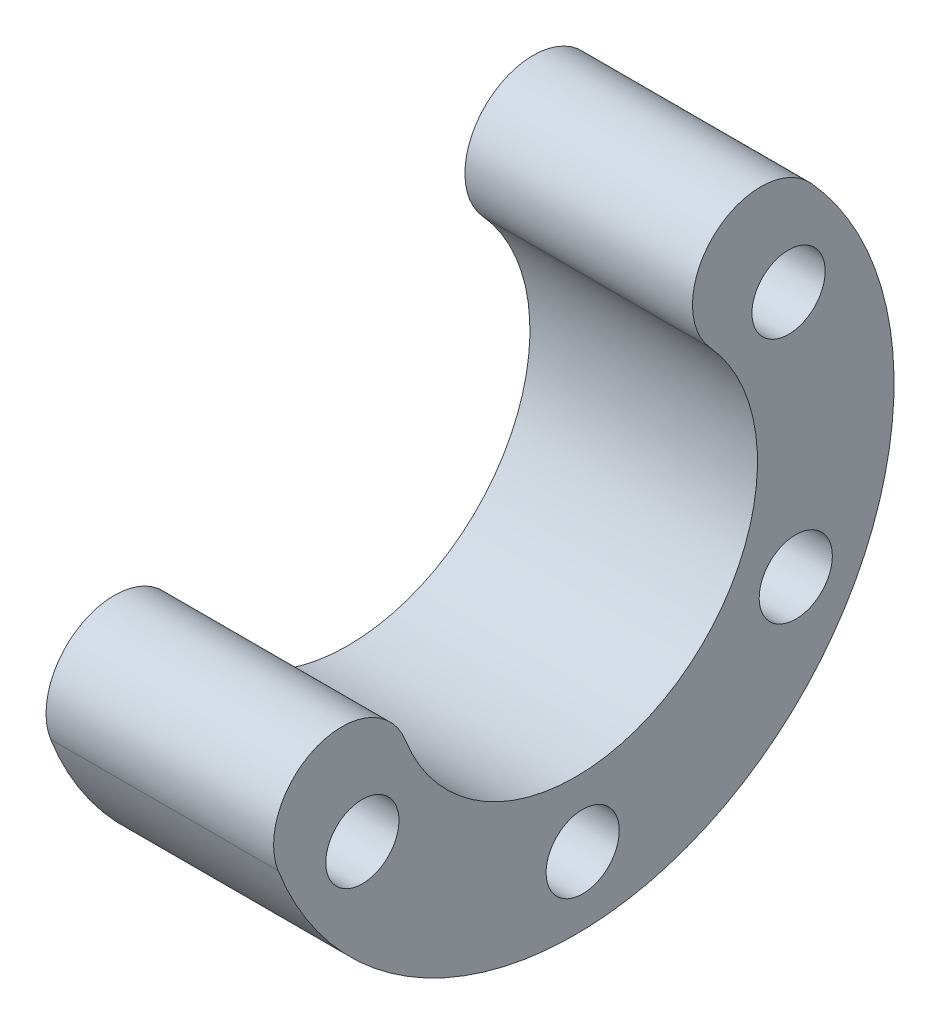
ISO-10303-21;
HEADER;
FILE_DESCRIPTION(('STEP AP214'),'2;1');
FILE_NAME('part.step','',(''),(''),'','','');
FILE_SCHEMA(('AUTOMOTIVE_DESIGN { 1 0 10303 214 1 1 1 1 }'));
ENDSEC;
DATA;
#1=APPLICATION_CONTEXT('core data for automotive mechanical design processes');
#2=APPLICATION_PROTOCOL_DEFINITION('international standard','automotive_design',2000,#1);
#3=PRODUCT_CONTEXT('',#1,'mechanical');
#4=PRODUCT('Part','Part','',(#3));
#5=PRODUCT_RELATED_PRODUCT_CATEGORY('part','',(#4));
#6=PRODUCT_DEFINITION_FORMATION('','',#4);
#7=PRODUCT_DEFINITION_CONTEXT('part definition',#1,'design');
#8=PRODUCT_DEFINITION('design','',#6,#7);
#9=PRODUCT_DEFINITION_SHAPE('','',#8);
#10=(LENGTH_UNIT() NAMED_UNIT(*) SI_UNIT(.MILLI.,.METRE.));
#11=(NAMED_UNIT(*) PLANE_ANGLE_UNIT() SI_UNIT($,.RADIAN.));
#12=(NAMED_UNIT(*) SI_UNIT($,.STERADIAN.) SOLID_ANGLE_UNIT());
#13=UNCERTAINTY_MEASURE_WITH_UNIT(LENGTH_MEASURE(1.E-05),#10,'distance_accuracy_value','');
#14=(GEOMETRIC_REPRESENTATION_CONTEXT(3) GLOBAL_UNCERTAINTY_ASSIGNED_CONTEXT((#13)) GLOBAL_UNIT_ASSIGNED_CONTEXT((#10,
#11,#12)) REPRESENTATION_CONTEXT('',''));
#15=CARTESIAN_POINT('',(0.,0.,0.));
#16=DIRECTION('',(0.,0.,1.));
#17=DIRECTION('',(1.,0.,0.));
#18=AXIS2_PLACEMENT_3D('',#15,#16,#17);
#19=CARTESIAN_POINT('',(295.275,283.808614119369,244.780770815134));
#20=DIRECTION('',(-1.,0.,0.));
#21=DIRECTION('',(0.,-1.,0.));
#22=AXIS2_PLACEMENT_3D('',#19,#20,#21);
#23=PLANE('',#22);
#24=CARTESIAN_POINT('',(295.275,249.599038311439,241.648955537477));
#25=DIRECTION('',(-1.,0.,0.));
#26=DIRECTION('',(0.,-1.,0.));
#27=AXIS2_PLACEMENT_3D('',#24,#25,#26);
#28=CIRCLE('',#27,2.5527);
#29=CARTESIAN_POINT('',(295.275,247.046338311439,241.648955537477));
#30=VERTEX_POINT('',#29);
#31=EDGE_CURVE('E79',#30,#30,#28,.F.);
#32=ORIENTED_EDGE('',*,*,#31,.T.);
#33=EDGE_LOOP('',(#32));
#34=FACE_BOUND('',#33,.T.);
#35=CARTESIAN_POINT('',(295.275,241.307253431596,226.28063715984));
#36=DIRECTION('',(-1.,0.,0.));
#37=DIRECTION('',(0.,-1.,0.));
#38=AXIS2_PLACEMENT_3D('',#35,#36,#37);
#39=CIRCLE('',#38,2.5527);
#40=CARTESIAN_POINT('',(295.275,238.754553431596,226.28063715984));
#41=VERTEX_POINT('',#40);
#42=EDGE_CURVE('E92',#41,#41,#39,.F.);
#43=ORIENTED_EDGE('',*,*,#42,.T.);
#44=EDGE_LOOP('',(#43));
#45=FACE_BOUND('',#44,.T.);
#46=CARTESIAN_POINT('',(295.275,270.504114631188,213.858212702891));
#47=DIRECTION('',(-1.,0.,0.));
#48=DIRECTION('',(0.,-1.,0.));
#49=AXIS2_PLACEMENT_3D('',#46,#47,#48);
#50=CIRCLE('',#49,4.7625);
#51=CARTESIAN_POINT('',(295.275,273.706373166967,210.333025258225));
#52=VERTEX_POINT('',#51);
#53=CARTESIAN_POINT('',(295.275,267.301856095409,217.383400147557));
#54=VERTEX_POINT('',#53);
#55=EDGE_CURVE('E74',#52,#54,#50,.F.);
#56=ORIENTED_EDGE('',*,*,#55,.F.);
#57=CARTESIAN_POINT('',(295.275,258.7625,226.7839));
#58=DIRECTION('',(-1.,0.,0.));
#59=DIRECTION('',(0.,-1.,0.));
#60=AXIS2_PLACEMENT_3D('',#57,#58,#59);
#61=CIRCLE('',#60,22.225);
#62=CARTESIAN_POINT('',(295.275,250.779259548962,247.52560911234));
#63=VERTEX_POINT('',#62);
#64=EDGE_CURVE('E62',#52,#63,#61,.T.);
#65=ORIENTED_EDGE('',*,*,#64,.T.);
#66=CARTESIAN_POINT('',(295.275,252.489953931327,243.080957159695));
#67=DIRECTION('',(-1.,0.,0.));
#68=DIRECTION('',(0.,-1.,0.));
#69=AXIS2_PLACEMENT_3D('',#66,#67,#68);
#70=CIRCLE('',#69,4.7625);
#71=CARTESIAN_POINT('',(295.275,254.200648313691,238.636305207051));
#72=VERTEX_POINT('',#71);
#73=EDGE_CURVE('E71',#63,#72,#70,.T.);
#74=ORIENTED_EDGE('',*,*,#73,.T.);
#75=CARTESIAN_POINT('',(295.275,258.7625,226.7839));
#76=DIRECTION('',(-1.,0.,0.));
#77=DIRECTION('',(0.,-1.,0.));
#78=AXIS2_PLACEMENT_3D('',#75,#76,#77);
#79=CIRCLE('',#78,12.7);
#80=EDGE_CURVE('E101',#54,#72,#79,.T.);
#81=ORIENTED_EDGE('',*,*,#80,.F.);
#82=EDGE_LOOP('',(#56,#65,#74,#81));
#83=FACE_BOUND('',#82,.T.);
#84=CARTESIAN_POINT('',(295.275,267.925961688557,211.918844462521));
#85=DIRECTION('',(-1.,0.,0.));
#86=DIRECTION('',(0.,-1.,0.));
#87=AXIS2_PLACEMENT_3D('',#84,#85,#86);
#88=CIRCLE('',#87,2.5527);
#89=CARTESIAN_POINT('',(295.275,265.373261688557,211.918844462521));
#90=VERTEX_POINT('',#89);
#91=EDGE_CURVE('E96',#90,#90,#88,.F.);
#92=ORIENTED_EDGE('',*,*,#91,.T.);
#93=EDGE_LOOP('',(#92));
#94=FACE_BOUND('',#93,.T.);
#95=CARTESIAN_POINT('',(295.275,250.470715120155,211.415581622363));
#96=DIRECTION('',(-1.,0.,0.));
#97=DIRECTION('',(0.,-1.,0.));
#98=AXIS2_PLACEMENT_3D('',#95,#96,#97);
#99=CIRCLE('',#98,2.5527);
#100=CARTESIAN_POINT('',(295.275,247.918015120155,211.415581622363));
#101=VERTEX_POINT('',#100);
#102=EDGE_CURVE('E85',#101,#101,#99,.F.);
#103=ORIENTED_EDGE('',*,*,#102,.T.);
#104=EDGE_LOOP('',(#103));
#105=FACE_BOUND('',#104,.T.);
#106=ADVANCED_FACE('F17',(#34,#45,#83,#94,#105),#23,.T.);
#107=CARTESIAN_POINT('',(295.273,258.7625,226.7839));
#108=DIRECTION('',(1.,0.,0.));
#109=DIRECTION('',(0.,1.,0.));
#110=AXIS2_PLACEMENT_3D('',#107,#108,#109);
#111=CYLINDRICAL_SURFACE('',#110,22.225);
#112=ORIENTED_EDGE('',*,*,#64,.F.);
#113=DIRECTION('',(1.,0.,0.));
#114=VECTOR('',#113,1.);
#115=CARTESIAN_POINT('',(295.273,273.706373166967,210.333025258225));
#116=LINE('',#115,#114);
#117=CARTESIAN_POINT('',(311.15,273.706373166967,210.333025258225));
#118=VERTEX_POINT('',#117);
#119=EDGE_CURVE('E35',#52,#118,#116,.T.);
#120=ORIENTED_EDGE('',*,*,#119,.T.);
#121=CARTESIAN_POINT('',(311.15,258.7625,226.7839));
#122=DIRECTION('',(-1.,0.,0.));
#123=DIRECTION('',(0.,-1.,0.));
#124=AXIS2_PLACEMENT_3D('',#121,#122,#123);
#125=CIRCLE('',#124,22.225);
#126=CARTESIAN_POINT('',(311.15,250.779259548962,247.52560911234));
#127=VERTEX_POINT('',#126);
#128=EDGE_CURVE('E63',#118,#127,#125,.T.);
#129=ORIENTED_EDGE('',*,*,#128,.T.);
#130=DIRECTION('',(1.,0.,0.));
#131=VECTOR('',#130,1.);
#132=CARTESIAN_POINT('',(295.273,250.779259548962,247.52560911234));
#133=LINE('',#132,#131);
#134=EDGE_CURVE('E43',#63,#127,#133,.T.);
#135=ORIENTED_EDGE('',*,*,#134,.F.);
#136=EDGE_LOOP('',(#112,#120,#129,#135));
#137=FACE_BOUND('',#136,.T.);
#138=ADVANCED_FACE('F61',(#137),#111,.T.);
#139=CARTESIAN_POINT('',(311.15,186.166852461199,298.45));
#140=DIRECTION('',(-1.,0.,0.));
#141=DIRECTION('',(0.,-1.,0.));
#142=AXIS2_PLACEMENT_3D('',#139,#140,#141);
#143=PLANE('',#142);
#144=CARTESIAN_POINT('',(311.15,267.925961688557,211.918844462521));
#145=DIRECTION('',(1.,0.,0.));
#146=DIRECTION('',(0.,1.,0.));
#147=AXIS2_PLACEMENT_3D('',#144,#145,#146);
#148=CIRCLE('',#147,2.5527);
#149=CARTESIAN_POINT('',(311.15,270.478661688557,211.918844462521));
#150=VERTEX_POINT('',#149);
#151=EDGE_CURVE('E11',#150,#150,#148,.T.);
#152=ORIENTED_EDGE('',*,*,#151,.F.);
#153=EDGE_LOOP('',(#152));
#154=FACE_BOUND('',#153,.T.);
#155=CARTESIAN_POINT('',(311.15,241.307253431596,226.28063715984));
#156=DIRECTION('',(1.,0.,0.));
#157=DIRECTION('',(0.,1.,0.));
#158=AXIS2_PLACEMENT_3D('',#155,#156,#157);
#159=CIRCLE('',#158,2.5527);
#160=CARTESIAN_POINT('',(311.15,243.859953431595,226.28063715984));
#161=VERTEX_POINT('',#160);
#162=EDGE_CURVE('E27',#161,#161,#159,.T.);
#163=ORIENTED_EDGE('',*,*,#162,.F.);
#164=EDGE_LOOP('',(#163));
#165=FACE_BOUND('',#164,.T.);
#166=CARTESIAN_POINT('',(311.15,250.470715120155,211.415581622363));
#167=DIRECTION('',(1.,0.,0.));
#168=DIRECTION('',(0.,1.,0.));
#169=AXIS2_PLACEMENT_3D('',#166,#167,#168);
#170=CIRCLE('',#169,2.5527);
#171=CARTESIAN_POINT('',(311.15,253.023415120155,211.415581622363));
#172=VERTEX_POINT('',#171);
#173=EDGE_CURVE('E127',#172,#172,#170,.T.);
#174=ORIENTED_EDGE('',*,*,#173,.F.);
#175=EDGE_LOOP('',(#174));
#176=FACE_BOUND('',#175,.T.);
#177=CARTESIAN_POINT('',(311.15,249.599038311439,241.648955537477));
#178=DIRECTION('',(1.,0.,0.));
#179=DIRECTION('',(0.,1.,0.));
#180=AXIS2_PLACEMENT_3D('',#177,#178,#179);
#181=CIRCLE('',#180,2.5527);
#182=CARTESIAN_POINT('',(311.15,252.151738311438,241.648955537477));
#183=VERTEX_POINT('',#182);
#184=EDGE_CURVE('E123',#183,#183,#181,.T.);
#185=ORIENTED_EDGE('',*,*,#184,.F.);
#186=EDGE_LOOP('',(#185));
#187=FACE_BOUND('',#186,.T.);
#188=CARTESIAN_POINT('',(311.15,270.504114631188,213.858212702891));
#189=DIRECTION('',(1.,0.,0.));
#190=DIRECTION('',(0.,-1.,0.));
#191=AXIS2_PLACEMENT_3D('',#188,#189,#190);
#192=CIRCLE('',#191,4.7625);
#193=CARTESIAN_POINT('',(311.15,267.301856095409,217.383400147557));
#194=VERTEX_POINT('',#193);
#195=EDGE_CURVE('E120',#118,#194,#192,.T.);
#196=ORIENTED_EDGE('',*,*,#195,.T.);
#197=CARTESIAN_POINT('',(311.15,258.7625,226.7839));
#198=DIRECTION('',(-1.,0.,0.));
#199=DIRECTION('',(0.,-1.,0.));
#200=AXIS2_PLACEMENT_3D('',#197,#198,#199);
#201=CIRCLE('',#200,12.7);
#202=CARTESIAN_POINT('',(311.15,254.200648313691,238.636305207051));
#203=VERTEX_POINT('',#202);
#204=EDGE_CURVE('E106',#194,#203,#201,.T.);
#205=ORIENTED_EDGE('',*,*,#204,.T.);
#206=CARTESIAN_POINT('',(311.15,252.489953931327,243.080957159695));
#207=DIRECTION('',(-1.,0.,0.));
#208=DIRECTION('',(0.,-1.,0.));
#209=AXIS2_PLACEMENT_3D('',#206,#207,#208);
#210=CIRCLE('',#209,4.7625);
#211=EDGE_CURVE('E113',#127,#203,#210,.T.);
#212=ORIENTED_EDGE('',*,*,#211,.F.);
#213=ORIENTED_EDGE('',*,*,#128,.F.);
#214=EDGE_LOOP('',(#196,#205,#212,#213));
#215=FACE_BOUND('',#214,.T.);
#216=ADVANCED_FACE('F147',(#154,#165,#176,#187,#215),#143,.F.);
#217=CARTESIAN_POINT('',(295.273,252.489953931327,243.080957159695));
#218=DIRECTION('',(1.,0.,0.));
#219=DIRECTION('',(0.,1.,0.));
#220=AXIS2_PLACEMENT_3D('',#217,#218,#219);
#221=CYLINDRICAL_SURFACE('',#220,4.7625);
#222=ORIENTED_EDGE('',*,*,#73,.F.);
#223=ORIENTED_EDGE('',*,*,#134,.T.);
#224=ORIENTED_EDGE('',*,*,#211,.T.);
#225=DIRECTION('',(1.,0.,0.));
#226=VECTOR('',#225,1.);
#227=CARTESIAN_POINT('',(295.273,254.200648313691,238.636305207051));
#228=LINE('',#227,#226);
#229=EDGE_CURVE('E65',#72,#203,#228,.T.);
#230=ORIENTED_EDGE('',*,*,#229,.F.);
#231=EDGE_LOOP('',(#222,#223,#224,#230));
#232=FACE_BOUND('',#231,.T.);
#233=ADVANCED_FACE('F77',(#232),#221,.T.);
#234=CARTESIAN_POINT('',(295.273,270.504114631188,213.858212702891));
#235=DIRECTION('',(1.,0.,0.));
#236=DIRECTION('',(0.,1.,0.));
#237=AXIS2_PLACEMENT_3D('',#234,#235,#236);
#238=CYLINDRICAL_SURFACE('',#237,4.7625);
#239=ORIENTED_EDGE('',*,*,#119,.F.);
#240=ORIENTED_EDGE('',*,*,#55,.T.);
#241=DIRECTION('',(1.,0.,0.));
#242=VECTOR('',#241,1.);
#243=CARTESIAN_POINT('',(295.273,267.301856095409,217.383400147557));
#244=LINE('',#243,#242);
#245=EDGE_CURVE('E21',#54,#194,#244,.T.);
#246=ORIENTED_EDGE('',*,*,#245,.T.);
#247=ORIENTED_EDGE('',*,*,#195,.F.);
#248=EDGE_LOOP('',(#239,#240,#246,#247));
#249=FACE_BOUND('',#248,.T.);
#250=ADVANCED_FACE('F136',(#249),#238,.T.);
#251=CARTESIAN_POINT('',(295.273,258.7625,226.7839));
#252=DIRECTION('',(1.,0.,0.));
#253=DIRECTION('',(0.,1.,0.));
#254=AXIS2_PLACEMENT_3D('',#251,#252,#253);
#255=CYLINDRICAL_SURFACE('',#254,12.7);
#256=ORIENTED_EDGE('',*,*,#245,.F.);
#257=ORIENTED_EDGE('',*,*,#80,.T.);
#258=ORIENTED_EDGE('',*,*,#229,.T.);
#259=ORIENTED_EDGE('',*,*,#204,.F.);
#260=EDGE_LOOP('',(#256,#257,#258,#259));
#261=FACE_BOUND('',#260,.T.);
#262=ADVANCED_FACE('F19',(#261),#255,.F.);
#263=CARTESIAN_POINT('',(295.273,267.925961688557,211.918844462521));
#264=DIRECTION('',(1.,0.,0.));
#265=DIRECTION('',(0.,1.,0.));
#266=AXIS2_PLACEMENT_3D('',#263,#264,#265);
#267=CYLINDRICAL_SURFACE('',#266,2.5527);
#268=ORIENTED_EDGE('',*,*,#151,.T.);
#269=EDGE_LOOP('',(#268));
#270=FACE_BOUND('',#269,.T.);
#271=ORIENTED_EDGE('',*,*,#91,.F.);
#272=EDGE_LOOP('',(#271));
#273=FACE_BOUND('',#272,.T.);
#274=ADVANCED_FACE('F138',(#270,#273),#267,.F.);
#275=CARTESIAN_POINT('',(295.273,241.307253431596,226.28063715984));
#276=DIRECTION('',(1.,0.,0.));
#277=DIRECTION('',(0.,1.,0.));
#278=AXIS2_PLACEMENT_3D('',#275,#276,#277);
#279=CYLINDRICAL_SURFACE('',#278,2.5527);
#280=ORIENTED_EDGE('',*,*,#162,.T.);
#281=EDGE_LOOP('',(#280));
#282=FACE_BOUND('',#281,.T.);
#283=ORIENTED_EDGE('',*,*,#42,.F.);
#284=EDGE_LOOP('',(#283));
#285=FACE_BOUND('',#284,.T.);
#286=ADVANCED_FACE('F143',(#282,#285),#279,.F.);
#287=CARTESIAN_POINT('',(295.273,250.470715120155,211.415581622363));
#288=DIRECTION('',(1.,0.,0.));
#289=DIRECTION('',(0.,1.,0.));
#290=AXIS2_PLACEMENT_3D('',#287,#288,#289);
#291=CYLINDRICAL_SURFACE('',#290,2.5527);
#292=ORIENTED_EDGE('',*,*,#173,.T.);
#293=EDGE_LOOP('',(#292));
#294=FACE_BOUND('',#293,.T.);
#295=ORIENTED_EDGE('',*,*,#102,.F.);
#296=EDGE_LOOP('',(#295));
#297=FACE_BOUND('',#296,.T.);
#298=ADVANCED_FACE('F162',(#294,#297),#291,.F.);
#299=CARTESIAN_POINT('',(295.273,249.599038311439,241.648955537477));
#300=DIRECTION('',(1.,0.,0.));
#301=DIRECTION('',(0.,1.,0.));
#302=AXIS2_PLACEMENT_3D('',#299,#300,#301);
#303=CYLINDRICAL_SURFACE('',#302,2.5527);
#304=ORIENTED_EDGE('',*,*,#184,.T.);
#305=EDGE_LOOP('',(#304));
#306=FACE_BOUND('',#305,.T.);
#307=ORIENTED_EDGE('',*,*,#31,.F.);
#308=EDGE_LOOP('',(#307));
#309=FACE_BOUND('',#308,.T.);
#310=ADVANCED_FACE('F156',(#306,#309),#303,.F.);
#311=CLOSED_SHELL('',(#106,#138,#216,#233,#250,#262,#274,#286,#298,#310));
#312=MANIFOLD_SOLID_BREP('B1',#311);
#313=ADVANCED_BREP_SHAPE_REPRESENTATION('',(#18,#312),#14);
#314=SHAPE_DEFINITION_REPRESENTATION(#9,#313);
ENDSEC;
END-ISO-10303-21;
